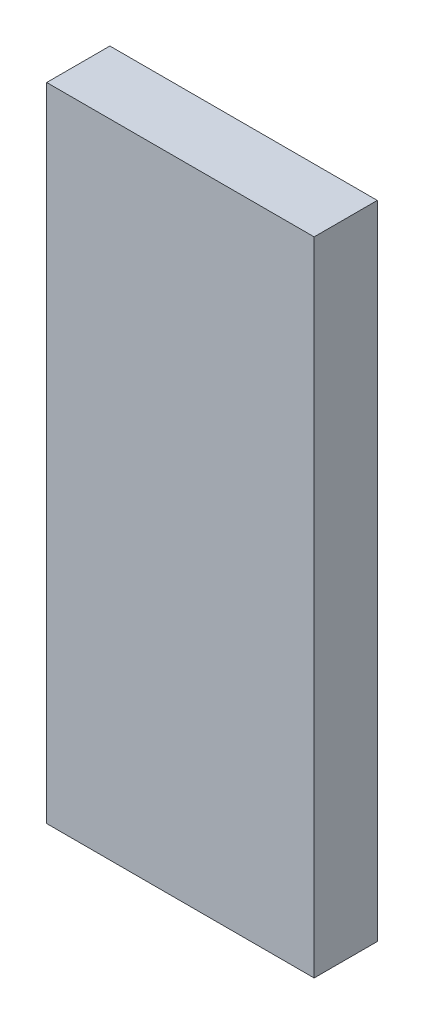
ISO-10303-21;
HEADER;
FILE_DESCRIPTION(('STEP AP214'),'2;1');
FILE_NAME('part.step','',(''),(''),'','','');
FILE_SCHEMA(('AUTOMOTIVE_DESIGN { 1 0 10303 214 1 1 1 1 }'));
ENDSEC;
DATA;
#1=APPLICATION_CONTEXT('core data for automotive mechanical design processes');
#2=APPLICATION_PROTOCOL_DEFINITION('international standard','automotive_design',2000,#1);
#3=PRODUCT_CONTEXT('',#1,'mechanical');
#4=PRODUCT('Part','Part','',(#3));
#5=PRODUCT_RELATED_PRODUCT_CATEGORY('part','',(#4));
#6=PRODUCT_DEFINITION_FORMATION('','',#4);
#7=PRODUCT_DEFINITION_CONTEXT('part definition',#1,'design');
#8=PRODUCT_DEFINITION('design','',#6,#7);
#9=PRODUCT_DEFINITION_SHAPE('','',#8);
#10=(LENGTH_UNIT() NAMED_UNIT(*) SI_UNIT(.MILLI.,.METRE.));
#11=(NAMED_UNIT(*) PLANE_ANGLE_UNIT() SI_UNIT($,.RADIAN.));
#12=(NAMED_UNIT(*) SI_UNIT($,.STERADIAN.) SOLID_ANGLE_UNIT());
#13=UNCERTAINTY_MEASURE_WITH_UNIT(LENGTH_MEASURE(1.E-05),#10,'distance_accuracy_value','');
#14=(GEOMETRIC_REPRESENTATION_CONTEXT(3) GLOBAL_UNCERTAINTY_ASSIGNED_CONTEXT((#13)) GLOBAL_UNIT_ASSIGNED_CONTEXT((#10,
#11,#12)) REPRESENTATION_CONTEXT('',''));
#15=CARTESIAN_POINT('',(0.,0.,0.));
#16=DIRECTION('',(0.,0.,1.));
#17=DIRECTION('',(1.,0.,0.));
#18=AXIS2_PLACEMENT_3D('',#15,#16,#17);
#19=CARTESIAN_POINT('',(0.,0.,15.));
#20=DIRECTION('',(1.,0.,0.));
#21=DIRECTION('',(0.,0.,-1.));
#22=AXIS2_PLACEMENT_3D('',#19,#20,#21);
#23=PLANE('',#22);
#24=DIRECTION('',(0.,-1.,0.));
#25=VECTOR('',#24,1.);
#26=CARTESIAN_POINT('',(0.,0.,0.));
#27=LINE('',#26,#25);
#28=CARTESIAN_POINT('',(0.,152.4,0.));
#29=VERTEX_POINT('',#28);
#30=CARTESIAN_POINT('',(0.,0.,0.));
#31=VERTEX_POINT('',#30);
#32=EDGE_CURVE('E96',#29,#31,#27,.T.);
#33=ORIENTED_EDGE('',*,*,#32,.T.);
#34=DIRECTION('',(0.,0.,-1.));
#35=VECTOR('',#34,1.);
#36=CARTESIAN_POINT('',(0.,0.,15.));
#37=LINE('',#36,#35);
#38=CARTESIAN_POINT('',(0.,0.,15.));
#39=VERTEX_POINT('',#38);
#40=EDGE_CURVE('E11',#39,#31,#37,.T.);
#41=ORIENTED_EDGE('',*,*,#40,.F.);
#42=DIRECTION('',(0.,-1.,0.));
#43=VECTOR('',#42,1.);
#44=CARTESIAN_POINT('',(0.,0.,15.));
#45=LINE('',#44,#43);
#46=CARTESIAN_POINT('',(0.,152.4,15.));
#47=VERTEX_POINT('',#46);
#48=EDGE_CURVE('E84',#47,#39,#45,.T.);
#49=ORIENTED_EDGE('',*,*,#48,.F.);
#50=DIRECTION('',(0.,0.,-1.));
#51=VECTOR('',#50,1.);
#52=CARTESIAN_POINT('',(0.,152.4,15.));
#53=LINE('',#52,#51);
#54=EDGE_CURVE('E92',#47,#29,#53,.T.);
#55=ORIENTED_EDGE('',*,*,#54,.T.);
#56=EDGE_LOOP('',(#33,#41,#49,#55));
#57=FACE_BOUND('',#56,.T.);
#58=ADVANCED_FACE('F33',(#57),#23,.F.);
#59=CARTESIAN_POINT('',(0.,0.,15.));
#60=DIRECTION('',(0.,1.,0.));
#61=DIRECTION('',(0.,0.,1.));
#62=AXIS2_PLACEMENT_3D('',#59,#60,#61);
#63=PLANE('',#62);
#64=DIRECTION('',(1.,0.,0.));
#65=VECTOR('',#64,1.);
#66=CARTESIAN_POINT('',(0.,0.,0.));
#67=LINE('',#66,#65);
#68=CARTESIAN_POINT('',(63.5,0.,0.));
#69=VERTEX_POINT('',#68);
#70=EDGE_CURVE('E88',#31,#69,#67,.T.);
#71=ORIENTED_EDGE('',*,*,#70,.T.);
#72=DIRECTION('',(0.,0.,-1.));
#73=VECTOR('',#72,1.);
#74=CARTESIAN_POINT('',(63.5,0.,15.));
#75=LINE('',#74,#73);
#76=CARTESIAN_POINT('',(63.5,0.,15.));
#77=VERTEX_POINT('',#76);
#78=EDGE_CURVE('E41',#77,#69,#75,.T.);
#79=ORIENTED_EDGE('',*,*,#78,.F.);
#80=DIRECTION('',(1.,0.,0.));
#81=VECTOR('',#80,1.);
#82=CARTESIAN_POINT('',(0.,0.,15.));
#83=LINE('',#82,#81);
#84=EDGE_CURVE('E79',#39,#77,#83,.T.);
#85=ORIENTED_EDGE('',*,*,#84,.F.);
#86=ORIENTED_EDGE('',*,*,#40,.T.);
#87=EDGE_LOOP('',(#71,#79,#85,#86));
#88=FACE_BOUND('',#87,.T.);
#89=ADVANCED_FACE('F87',(#88),#63,.F.);
#90=CARTESIAN_POINT('',(63.5,0.,15.));
#91=DIRECTION('',(-1.,0.,0.));
#92=DIRECTION('',(0.,0.,1.));
#93=AXIS2_PLACEMENT_3D('',#90,#91,#92);
#94=PLANE('',#93);
#95=DIRECTION('',(0.,1.,0.));
#96=VECTOR('',#95,1.);
#97=CARTESIAN_POINT('',(63.5,0.,0.));
#98=LINE('',#97,#96);
#99=CARTESIAN_POINT('',(63.5,152.4,0.));
#100=VERTEX_POINT('',#99);
#101=EDGE_CURVE('E66',#69,#100,#98,.T.);
#102=ORIENTED_EDGE('',*,*,#101,.T.);
#103=DIRECTION('',(0.,0.,-1.));
#104=VECTOR('',#103,1.);
#105=CARTESIAN_POINT('',(63.5,152.4,15.));
#106=LINE('',#105,#104);
#107=CARTESIAN_POINT('',(63.5,152.4,15.));
#108=VERTEX_POINT('',#107);
#109=EDGE_CURVE('E89',#108,#100,#106,.T.);
#110=ORIENTED_EDGE('',*,*,#109,.F.);
#111=DIRECTION('',(0.,1.,0.));
#112=VECTOR('',#111,1.);
#113=CARTESIAN_POINT('',(63.5,0.,15.));
#114=LINE('',#113,#112);
#115=EDGE_CURVE('E82',#77,#108,#114,.T.);
#116=ORIENTED_EDGE('',*,*,#115,.F.);
#117=ORIENTED_EDGE('',*,*,#78,.T.);
#118=EDGE_LOOP('',(#102,#110,#116,#117));
#119=FACE_BOUND('',#118,.T.);
#120=ADVANCED_FACE('F90',(#119),#94,.F.);
#121=CARTESIAN_POINT('',(0.,152.4,15.));
#122=DIRECTION('',(0.,-1.,0.));
#123=DIRECTION('',(0.,0.,-1.));
#124=AXIS2_PLACEMENT_3D('',#121,#122,#123);
#125=PLANE('',#124);
#126=DIRECTION('',(-1.,0.,0.));
#127=VECTOR('',#126,1.);
#128=CARTESIAN_POINT('',(0.,152.4,0.));
#129=LINE('',#128,#127);
#130=EDGE_CURVE('E72',#100,#29,#129,.T.);
#131=ORIENTED_EDGE('',*,*,#130,.T.);
#132=ORIENTED_EDGE('',*,*,#54,.F.);
#133=DIRECTION('',(-1.,0.,0.));
#134=VECTOR('',#133,1.);
#135=CARTESIAN_POINT('',(0.,152.4,15.));
#136=LINE('',#135,#134);
#137=EDGE_CURVE('E49',#108,#47,#136,.T.);
#138=ORIENTED_EDGE('',*,*,#137,.F.);
#139=ORIENTED_EDGE('',*,*,#109,.T.);
#140=EDGE_LOOP('',(#131,#132,#138,#139));
#141=FACE_BOUND('',#140,.T.);
#142=ADVANCED_FACE('F103',(#141),#125,.F.);
#143=CARTESIAN_POINT('',(0.,0.,15.));
#144=DIRECTION('',(0.,0.,-1.));
#145=DIRECTION('',(-1.,0.,0.));
#146=AXIS2_PLACEMENT_3D('',#143,#144,#145);
#147=PLANE('',#146);
#148=ORIENTED_EDGE('',*,*,#48,.T.);
#149=ORIENTED_EDGE('',*,*,#84,.T.);
#150=ORIENTED_EDGE('',*,*,#115,.T.);
#151=ORIENTED_EDGE('',*,*,#137,.T.);
#152=EDGE_LOOP('',(#148,#149,#150,#151));
#153=FACE_BOUND('',#152,.T.);
#154=ADVANCED_FACE('F80',(#153),#147,.F.);
#155=CARTESIAN_POINT('',(0.,0.,0.));
#156=DIRECTION('',(0.,0.,-1.));
#157=DIRECTION('',(-1.,0.,0.));
#158=AXIS2_PLACEMENT_3D('',#155,#156,#157);
#159=PLANE('',#158);
#160=ORIENTED_EDGE('',*,*,#32,.F.);
#161=ORIENTED_EDGE('',*,*,#130,.F.);
#162=ORIENTED_EDGE('',*,*,#101,.F.);
#163=ORIENTED_EDGE('',*,*,#70,.F.);
#164=EDGE_LOOP('',(#160,#161,#162,#163));
#165=FACE_BOUND('',#164,.T.);
#166=ADVANCED_FACE('F106',(#165),#159,.T.);
#167=CLOSED_SHELL('',(#58,#89,#120,#142,#154,#166));
#168=MANIFOLD_SOLID_BREP('B2',#167);
#169=ADVANCED_BREP_SHAPE_REPRESENTATION('',(#18,#168),#14);
#170=SHAPE_DEFINITION_REPRESENTATION(#9,#169);
ENDSEC;
END-ISO-10303-21;
